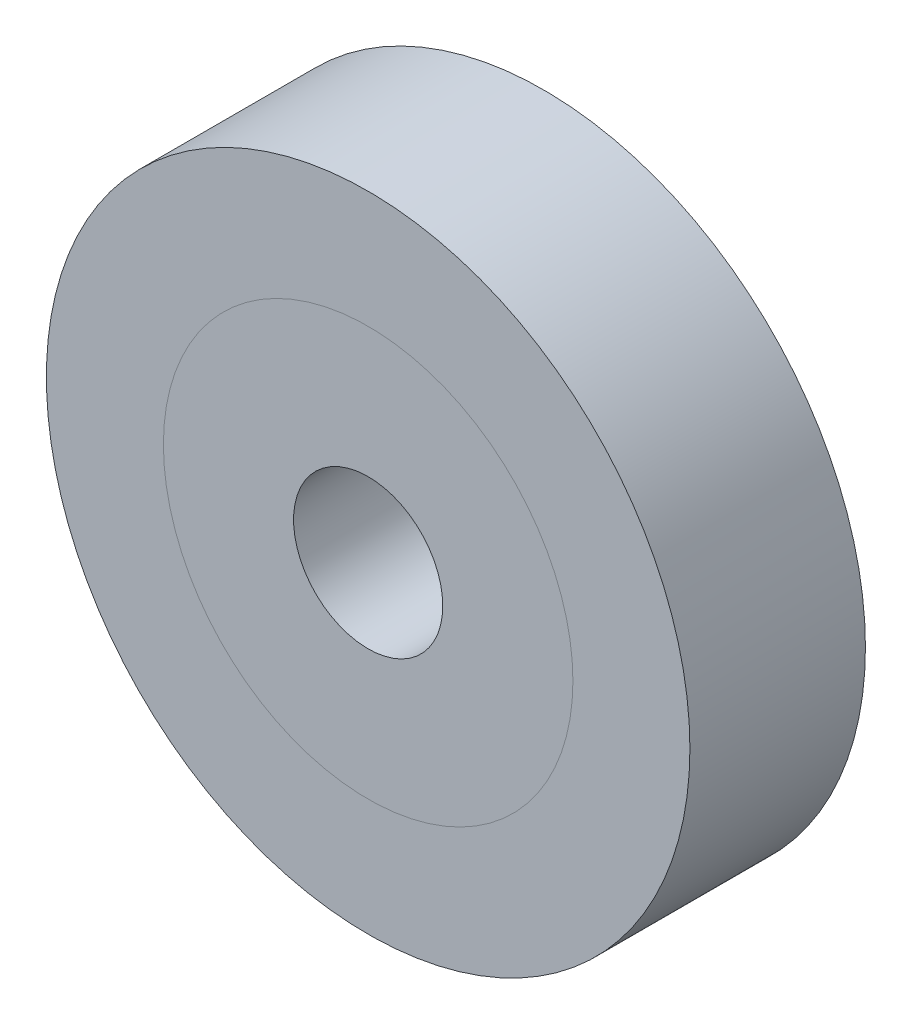
ISO-10303-21;
HEADER;
FILE_DESCRIPTION(('STEP AP214'),'2;1');
FILE_NAME('part.step','',(''),(''),'','','');
FILE_SCHEMA(('AUTOMOTIVE_DESIGN { 1 0 10303 214 1 1 1 1 }'));
ENDSEC;
DATA;
#1=APPLICATION_CONTEXT('core data for automotive mechanical design processes');
#2=APPLICATION_PROTOCOL_DEFINITION('international standard','automotive_design',2000,#1);
#3=PRODUCT_CONTEXT('',#1,'mechanical');
#4=PRODUCT('Part','Part','',(#3));
#5=PRODUCT_RELATED_PRODUCT_CATEGORY('part','',(#4));
#6=PRODUCT_DEFINITION_FORMATION('','',#4);
#7=PRODUCT_DEFINITION_CONTEXT('part definition',#1,'design');
#8=PRODUCT_DEFINITION('design','',#6,#7);
#9=PRODUCT_DEFINITION_SHAPE('','',#8);
#10=(LENGTH_UNIT() NAMED_UNIT(*) SI_UNIT(.MILLI.,.METRE.));
#11=(NAMED_UNIT(*) PLANE_ANGLE_UNIT() SI_UNIT($,.RADIAN.));
#12=(NAMED_UNIT(*) SI_UNIT($,.STERADIAN.) SOLID_ANGLE_UNIT());
#13=UNCERTAINTY_MEASURE_WITH_UNIT(LENGTH_MEASURE(1.E-05),#10,'distance_accuracy_value','');
#14=(GEOMETRIC_REPRESENTATION_CONTEXT(3) GLOBAL_UNCERTAINTY_ASSIGNED_CONTEXT((#13)) GLOBAL_UNIT_ASSIGNED_CONTEXT((#10,
#11,#12)) REPRESENTATION_CONTEXT('',''));
#15=CARTESIAN_POINT('',(0.,0.,0.));
#16=DIRECTION('',(0.,0.,1.));
#17=DIRECTION('',(1.,0.,0.));
#18=AXIS2_PLACEMENT_3D('',#15,#16,#17);
#19=CARTESIAN_POINT('',(0.,0.,-0.00999999999999959));
#20=DIRECTION('',(0.,0.,1.));
#21=DIRECTION('',(1.,0.,0.));
#22=AXIS2_PLACEMENT_3D('',#19,#20,#21);
#23=CYLINDRICAL_SURFACE('',#22,14.);
#24=CARTESIAN_POINT('',(0.,0.,0.));
#25=DIRECTION('',(0.,0.,1.));
#26=DIRECTION('',(1.,0.,0.));
#27=AXIS2_PLACEMENT_3D('',#24,#25,#26);
#28=CIRCLE('',#27,14.);
#29=CARTESIAN_POINT('',(14.,0.,0.));
#30=VERTEX_POINT('',#29);
#31=EDGE_CURVE('E54',#30,#30,#28,.T.);
#32=ORIENTED_EDGE('',*,*,#31,.T.);
#33=EDGE_LOOP('',(#32));
#34=FACE_BOUND('',#33,.T.);
#35=CARTESIAN_POINT('',(0.,0.,12.));
#36=DIRECTION('',(0.,0.,1.));
#37=DIRECTION('',(1.,0.,0.));
#38=AXIS2_PLACEMENT_3D('',#35,#36,#37);
#39=CIRCLE('',#38,14.);
#40=CARTESIAN_POINT('',(14.,0.,12.));
#41=VERTEX_POINT('',#40);
#42=EDGE_CURVE('E63',#41,#41,#39,.T.);
#43=ORIENTED_EDGE('',*,*,#42,.F.);
#44=EDGE_LOOP('',(#43));
#45=FACE_BOUND('',#44,.T.);
#46=ADVANCED_FACE('F50',(#34,#45),#23,.T.);
#47=CARTESIAN_POINT('',(0.,0.,12.));
#48=DIRECTION('',(0.,0.,1.));
#49=DIRECTION('',(1.,0.,0.));
#50=AXIS2_PLACEMENT_3D('',#47,#48,#49);
#51=PLANE('',#50);
#52=CARTESIAN_POINT('',(0.,0.,12.));
#53=DIRECTION('',(0.,0.,1.));
#54=DIRECTION('',(1.,0.,0.));
#55=AXIS2_PLACEMENT_3D('',#52,#53,#54);
#56=CIRCLE('',#55,5.1);
#57=CARTESIAN_POINT('',(5.1,0.,12.));
#58=VERTEX_POINT('',#57);
#59=EDGE_CURVE('E58',#58,#58,#56,.T.);
#60=ORIENTED_EDGE('',*,*,#59,.F.);
#61=EDGE_LOOP('',(#60));
#62=FACE_BOUND('',#61,.T.);
#63=ORIENTED_EDGE('',*,*,#42,.T.);
#64=EDGE_LOOP('',(#63));
#65=FACE_BOUND('',#64,.T.);
#66=ADVANCED_FACE('F52',(#62,#65),#51,.T.);
#67=CARTESIAN_POINT('',(0.,0.,0.));
#68=DIRECTION('',(0.,0.,1.));
#69=DIRECTION('',(1.,0.,0.));
#70=AXIS2_PLACEMENT_3D('',#67,#68,#69);
#71=PLANE('',#70);
#72=CARTESIAN_POINT('',(0.,0.,0.));
#73=DIRECTION('',(0.,0.,1.));
#74=DIRECTION('',(1.,0.,0.));
#75=AXIS2_PLACEMENT_3D('',#72,#73,#74);
#76=CIRCLE('',#75,5.1);
#77=CARTESIAN_POINT('',(5.1,0.,0.));
#78=VERTEX_POINT('',#77);
#79=EDGE_CURVE('E11',#78,#78,#76,.T.);
#80=ORIENTED_EDGE('',*,*,#79,.T.);
#81=EDGE_LOOP('',(#80));
#82=FACE_BOUND('',#81,.T.);
#83=ORIENTED_EDGE('',*,*,#31,.F.);
#84=EDGE_LOOP('',(#83));
#85=FACE_BOUND('',#84,.T.);
#86=ADVANCED_FACE('F73',(#82,#85),#71,.F.);
#87=CARTESIAN_POINT('',(0.,0.,12.));
#88=DIRECTION('',(0.,0.,-1.));
#89=DIRECTION('',(-1.,0.,0.));
#90=AXIS2_PLACEMENT_3D('',#87,#88,#89);
#91=CYLINDRICAL_SURFACE('',#90,5.1);
#92=ORIENTED_EDGE('',*,*,#59,.T.);
#93=EDGE_LOOP('',(#92));
#94=FACE_BOUND('',#93,.T.);
#95=ORIENTED_EDGE('',*,*,#79,.F.);
#96=EDGE_LOOP('',(#95));
#97=FACE_BOUND('',#96,.T.);
#98=ADVANCED_FACE('F75',(#94,#97),#91,.F.);
#99=CLOSED_SHELL('',(#46,#66,#86,#98));
#100=MANIFOLD_SOLID_BREP('B2',#99);
#101=CARTESIAN_POINT('',(0.,0.,-0.00999999999999959));
#102=DIRECTION('',(0.,0.,1.));
#103=DIRECTION('',(1.,0.,0.));
#104=AXIS2_PLACEMENT_3D('',#101,#102,#103);
#105=CYLINDRICAL_SURFACE('',#104,14.);
#106=CARTESIAN_POINT('',(0.,0.,12.));
#107=DIRECTION('',(0.,0.,1.));
#108=DIRECTION('',(1.,0.,0.));
#109=AXIS2_PLACEMENT_3D('',#106,#107,#108);
#110=CIRCLE('',#109,14.);
#111=CARTESIAN_POINT('',(14.,0.,12.));
#112=VERTEX_POINT('',#111);
#113=EDGE_CURVE('E49',#112,#112,#110,.T.);
#114=ORIENTED_EDGE('',*,*,#113,.T.);
#115=EDGE_LOOP('',(#114));
#116=FACE_BOUND('',#115,.T.);
#117=CARTESIAN_POINT('',(0.,0.,0.));
#118=DIRECTION('',(0.,0.,1.));
#119=DIRECTION('',(1.,0.,0.));
#120=AXIS2_PLACEMENT_3D('',#117,#118,#119);
#121=CIRCLE('',#120,14.);
#122=CARTESIAN_POINT('',(14.,0.,0.));
#123=VERTEX_POINT('',#122);
#124=EDGE_CURVE('E116',#123,#123,#121,.T.);
#125=ORIENTED_EDGE('',*,*,#124,.F.);
#126=EDGE_LOOP('',(#125));
#127=FACE_BOUND('',#126,.T.);
#128=ADVANCED_FACE('F109',(#116,#127),#105,.F.);
#129=CARTESIAN_POINT('',(0.,0.,12.));
#130=DIRECTION('',(0.,0.,-1.));
#131=DIRECTION('',(-1.,0.,0.));
#132=AXIS2_PLACEMENT_3D('',#129,#130,#131);
#133=CYLINDRICAL_SURFACE('',#132,22.);
#134=CARTESIAN_POINT('',(0.,0.,12.));
#135=DIRECTION('',(0.,0.,1.));
#136=DIRECTION('',(1.,0.,0.));
#137=AXIS2_PLACEMENT_3D('',#134,#135,#136);
#138=CIRCLE('',#137,22.);
#139=CARTESIAN_POINT('',(22.,0.,12.));
#140=VERTEX_POINT('',#139);
#141=EDGE_CURVE('E121',#140,#140,#138,.T.);
#142=ORIENTED_EDGE('',*,*,#141,.F.);
#143=EDGE_LOOP('',(#142));
#144=FACE_BOUND('',#143,.T.);
#145=CARTESIAN_POINT('',(0.,0.,0.));
#146=DIRECTION('',(0.,0.,1.));
#147=DIRECTION('',(1.,0.,0.));
#148=AXIS2_PLACEMENT_3D('',#145,#146,#147);
#149=CIRCLE('',#148,22.);
#150=CARTESIAN_POINT('',(22.,0.,0.));
#151=VERTEX_POINT('',#150);
#152=EDGE_CURVE('E126',#151,#151,#149,.T.);
#153=ORIENTED_EDGE('',*,*,#152,.T.);
#154=EDGE_LOOP('',(#153));
#155=FACE_BOUND('',#154,.T.);
#156=ADVANCED_FACE('F133',(#144,#155),#133,.T.);
#157=CARTESIAN_POINT('',(0.,0.,0.));
#158=DIRECTION('',(0.,0.,1.));
#159=DIRECTION('',(1.,0.,0.));
#160=AXIS2_PLACEMENT_3D('',#157,#158,#159);
#161=PLANE('',#160);
#162=ORIENTED_EDGE('',*,*,#124,.T.);
#163=EDGE_LOOP('',(#162));
#164=FACE_BOUND('',#163,.T.);
#165=ORIENTED_EDGE('',*,*,#152,.F.);
#166=EDGE_LOOP('',(#165));
#167=FACE_BOUND('',#166,.T.);
#168=ADVANCED_FACE('F135',(#164,#167),#161,.F.);
#169=CARTESIAN_POINT('',(0.,0.,12.));
#170=DIRECTION('',(0.,0.,1.));
#171=DIRECTION('',(1.,0.,0.));
#172=AXIS2_PLACEMENT_3D('',#169,#170,#171);
#173=PLANE('',#172);
#174=ORIENTED_EDGE('',*,*,#113,.F.);
#175=EDGE_LOOP('',(#174));
#176=FACE_BOUND('',#175,.T.);
#177=ORIENTED_EDGE('',*,*,#141,.T.);
#178=EDGE_LOOP('',(#177));
#179=FACE_BOUND('',#178,.T.);
#180=ADVANCED_FACE('F137',(#176,#179),#173,.T.);
#181=CLOSED_SHELL('',(#128,#156,#168,#180));
#182=MANIFOLD_SOLID_BREP('B6',#181);
#183=ADVANCED_BREP_SHAPE_REPRESENTATION('',(#18,#100,#182),#14);
#184=SHAPE_DEFINITION_REPRESENTATION(#9,#183);
ENDSEC;
END-ISO-10303-21;
